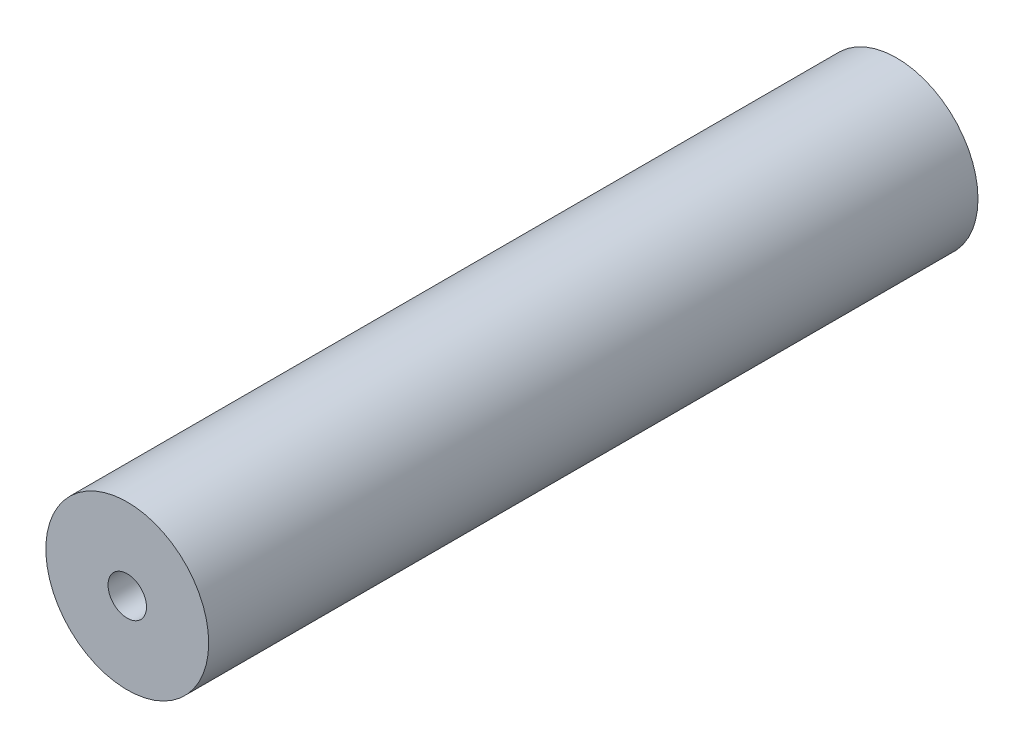
ISO-10303-21;
HEADER;
FILE_DESCRIPTION(('STEP AP214'),'2;1');
FILE_NAME('part.step','',(''),(''),'','','');
FILE_SCHEMA(('AUTOMOTIVE_DESIGN { 1 0 10303 214 1 1 1 1 }'));
ENDSEC;
DATA;
#1=APPLICATION_CONTEXT('core data for automotive mechanical design processes');
#2=APPLICATION_PROTOCOL_DEFINITION('international standard','automotive_design',2000,#1);
#3=PRODUCT_CONTEXT('',#1,'mechanical');
#4=PRODUCT('Part','Part','',(#3));
#5=PRODUCT_RELATED_PRODUCT_CATEGORY('part','',(#4));
#6=PRODUCT_DEFINITION_FORMATION('','',#4);
#7=PRODUCT_DEFINITION_CONTEXT('part definition',#1,'design');
#8=PRODUCT_DEFINITION('design','',#6,#7);
#9=PRODUCT_DEFINITION_SHAPE('','',#8);
#10=(LENGTH_UNIT() NAMED_UNIT(*) SI_UNIT(.MILLI.,.METRE.));
#11=(NAMED_UNIT(*) PLANE_ANGLE_UNIT() SI_UNIT($,.RADIAN.));
#12=(NAMED_UNIT(*) SI_UNIT($,.STERADIAN.) SOLID_ANGLE_UNIT());
#13=UNCERTAINTY_MEASURE_WITH_UNIT(LENGTH_MEASURE(1.E-05),#10,'distance_accuracy_value','');
#14=(GEOMETRIC_REPRESENTATION_CONTEXT(3) GLOBAL_UNCERTAINTY_ASSIGNED_CONTEXT((#13)) GLOBAL_UNIT_ASSIGNED_CONTEXT((#10,
#11,#12)) REPRESENTATION_CONTEXT('',''));
#15=CARTESIAN_POINT('',(0.,0.,0.));
#16=DIRECTION('',(0.,0.,1.));
#17=DIRECTION('',(1.,0.,0.));
#18=AXIS2_PLACEMENT_3D('',#15,#16,#17);
#19=CARTESIAN_POINT('',(0.,0.,30.));
#20=DIRECTION('',(0.,0.,1.));
#21=DIRECTION('',(1.,0.,0.));
#22=AXIS2_PLACEMENT_3D('',#19,#20,#21);
#23=PLANE('',#22);
#24=CARTESIAN_POINT('',(0.,0.,30.));
#25=DIRECTION('',(0.,0.,1.));
#26=DIRECTION('',(1.,0.,0.));
#27=AXIS2_PLACEMENT_3D('',#24,#25,#26);
#28=CIRCLE('',#27,3.175);
#29=CARTESIAN_POINT('',(3.175,0.,30.));
#30=VERTEX_POINT('',#29);
#31=EDGE_CURVE('E10',#30,#30,#28,.T.);
#32=ORIENTED_EDGE('',*,*,#31,.T.);
#33=EDGE_LOOP('',(#32));
#34=FACE_BOUND('',#33,.T.);
#35=CARTESIAN_POINT('',(0.,0.,30.));
#36=DIRECTION('',(0.,0.,1.));
#37=DIRECTION('',(1.,0.,0.));
#38=AXIS2_PLACEMENT_3D('',#35,#36,#37);
#39=CIRCLE('',#38,0.75);
#40=CARTESIAN_POINT('',(0.75,0.,30.));
#41=VERTEX_POINT('',#40);
#42=EDGE_CURVE('E42',#41,#41,#39,.T.);
#43=ORIENTED_EDGE('',*,*,#42,.F.);
#44=EDGE_LOOP('',(#43));
#45=FACE_BOUND('',#44,.T.);
#46=ADVANCED_FACE('F31',(#34,#45),#23,.T.);
#47=CARTESIAN_POINT('',(0.,0.,0.));
#48=DIRECTION('',(0.,0.,1.));
#49=DIRECTION('',(1.,0.,0.));
#50=AXIS2_PLACEMENT_3D('',#47,#48,#49);
#51=PLANE('',#50);
#52=CARTESIAN_POINT('',(0.,0.,0.));
#53=DIRECTION('',(0.,0.,1.));
#54=DIRECTION('',(1.,0.,0.));
#55=AXIS2_PLACEMENT_3D('',#52,#53,#54);
#56=CIRCLE('',#55,3.175);
#57=CARTESIAN_POINT('',(3.175,0.,0.));
#58=VERTEX_POINT('',#57);
#59=EDGE_CURVE('E35',#58,#58,#56,.T.);
#60=ORIENTED_EDGE('',*,*,#59,.F.);
#61=EDGE_LOOP('',(#60));
#62=FACE_BOUND('',#61,.T.);
#63=CARTESIAN_POINT('',(0.,0.,0.));
#64=DIRECTION('',(0.,0.,1.));
#65=DIRECTION('',(1.,0.,0.));
#66=AXIS2_PLACEMENT_3D('',#63,#64,#65);
#67=CIRCLE('',#66,0.75);
#68=CARTESIAN_POINT('',(0.75,0.,0.));
#69=VERTEX_POINT('',#68);
#70=EDGE_CURVE('E44',#69,#69,#67,.T.);
#71=ORIENTED_EDGE('',*,*,#70,.T.);
#72=EDGE_LOOP('',(#71));
#73=FACE_BOUND('',#72,.T.);
#74=ADVANCED_FACE('F54',(#62,#73),#51,.F.);
#75=CARTESIAN_POINT('',(0.,0.,30.));
#76=DIRECTION('',(0.,0.,-1.));
#77=DIRECTION('',(-1.,0.,0.));
#78=AXIS2_PLACEMENT_3D('',#75,#76,#77);
#79=CYLINDRICAL_SURFACE('',#78,3.175);
#80=ORIENTED_EDGE('',*,*,#31,.F.);
#81=EDGE_LOOP('',(#80));
#82=FACE_BOUND('',#81,.T.);
#83=ORIENTED_EDGE('',*,*,#59,.T.);
#84=EDGE_LOOP('',(#83));
#85=FACE_BOUND('',#84,.T.);
#86=ADVANCED_FACE('F33',(#82,#85),#79,.T.);
#87=CARTESIAN_POINT('',(0.,0.,30.));
#88=DIRECTION('',(0.,0.,-1.));
#89=DIRECTION('',(-1.,0.,0.));
#90=AXIS2_PLACEMENT_3D('',#87,#88,#89);
#91=CYLINDRICAL_SURFACE('',#90,0.75);
#92=ORIENTED_EDGE('',*,*,#42,.T.);
#93=EDGE_LOOP('',(#92));
#94=FACE_BOUND('',#93,.T.);
#95=ORIENTED_EDGE('',*,*,#70,.F.);
#96=EDGE_LOOP('',(#95));
#97=FACE_BOUND('',#96,.T.);
#98=ADVANCED_FACE('F50',(#94,#97),#91,.F.);
#99=CLOSED_SHELL('',(#46,#74,#86,#98));
#100=MANIFOLD_SOLID_BREP('B2',#99);
#101=ADVANCED_BREP_SHAPE_REPRESENTATION('',(#18,#100),#14);
#102=SHAPE_DEFINITION_REPRESENTATION(#9,#101);
ENDSEC;
END-ISO-10303-21;
